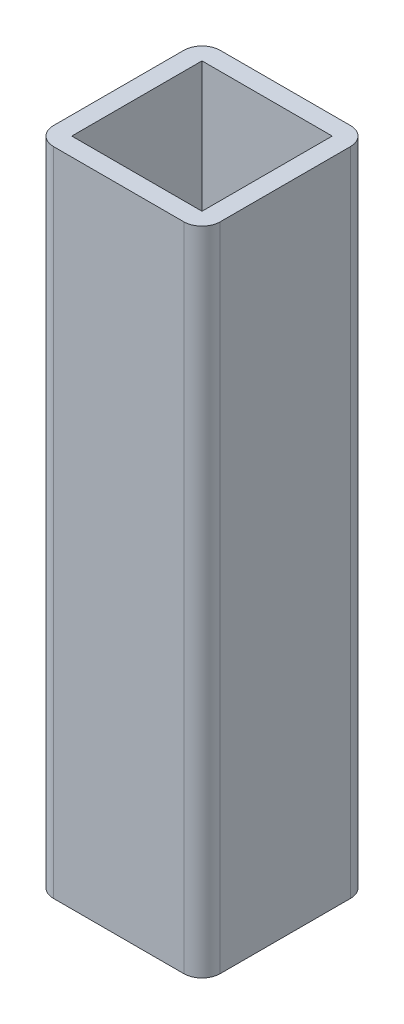
ISO-10303-21;
HEADER;
FILE_DESCRIPTION(('STEP AP214'),'2;1');
FILE_NAME('part.step','',(''),(''),'','','');
FILE_SCHEMA(('AUTOMOTIVE_DESIGN { 1 0 10303 214 1 1 1 1 }'));
ENDSEC;
DATA;
#1=APPLICATION_CONTEXT('core data for automotive mechanical design processes');
#2=APPLICATION_PROTOCOL_DEFINITION('international standard','automotive_design',2000,#1);
#3=PRODUCT_CONTEXT('',#1,'mechanical');
#4=PRODUCT('Part','Part','',(#3));
#5=PRODUCT_RELATED_PRODUCT_CATEGORY('part','',(#4));
#6=PRODUCT_DEFINITION_FORMATION('','',#4);
#7=PRODUCT_DEFINITION_CONTEXT('part definition',#1,'design');
#8=PRODUCT_DEFINITION('design','',#6,#7);
#9=PRODUCT_DEFINITION_SHAPE('','',#8);
#10=(LENGTH_UNIT() NAMED_UNIT(*) SI_UNIT(.MILLI.,.METRE.));
#11=(NAMED_UNIT(*) PLANE_ANGLE_UNIT() SI_UNIT($,.RADIAN.));
#12=(NAMED_UNIT(*) SI_UNIT($,.STERADIAN.) SOLID_ANGLE_UNIT());
#13=UNCERTAINTY_MEASURE_WITH_UNIT(LENGTH_MEASURE(1.E-05),#10,'distance_accuracy_value','');
#14=(GEOMETRIC_REPRESENTATION_CONTEXT(3) GLOBAL_UNCERTAINTY_ASSIGNED_CONTEXT((#13)) GLOBAL_UNIT_ASSIGNED_CONTEXT((#10,
#11,#12)) REPRESENTATION_CONTEXT('',''));
#15=CARTESIAN_POINT('',(0.,0.,0.));
#16=DIRECTION('',(0.,0.,1.));
#17=DIRECTION('',(1.,0.,0.));
#18=AXIS2_PLACEMENT_3D('',#15,#16,#17);
#19=CARTESIAN_POINT('',(22.8,100.,2.8));
#20=DIRECTION('',(0.,-1.,0.));
#21=DIRECTION('',(0.,0.,-1.));
#22=AXIS2_PLACEMENT_3D('',#19,#20,#21);
#23=CYLINDRICAL_SURFACE('',#22,2.8);
#24=CARTESIAN_POINT('',(22.8,0.,2.8));
#25=DIRECTION('',(0.,1.,0.));
#26=DIRECTION('',(0.,0.,-1.));
#27=AXIS2_PLACEMENT_3D('',#24,#25,#26);
#28=CIRCLE('',#27,2.8);
#29=CARTESIAN_POINT('',(25.6,0.,2.80000000000002));
#30=VERTEX_POINT('',#29);
#31=CARTESIAN_POINT('',(22.8,0.,0.));
#32=VERTEX_POINT('',#31);
#33=EDGE_CURVE('E157',#30,#32,#28,.T.);
#34=ORIENTED_EDGE('',*,*,#33,.T.);
#35=DIRECTION('',(0.,-1.,0.));
#36=VECTOR('',#35,1.);
#37=CARTESIAN_POINT('',(22.8,100.,0.));
#38=LINE('',#37,#36);
#39=CARTESIAN_POINT('',(22.8,100.,0.));
#40=VERTEX_POINT('',#39);
#41=EDGE_CURVE('E11',#40,#32,#38,.T.);
#42=ORIENTED_EDGE('',*,*,#41,.F.);
#43=CARTESIAN_POINT('',(22.8,100.,2.8));
#44=DIRECTION('',(0.,1.,0.));
#45=DIRECTION('',(0.,0.,-1.));
#46=AXIS2_PLACEMENT_3D('',#43,#44,#45);
#47=CIRCLE('',#46,2.8);
#48=CARTESIAN_POINT('',(25.6,100.,2.80000000000002));
#49=VERTEX_POINT('',#48);
#50=EDGE_CURVE('E158',#49,#40,#47,.T.);
#51=ORIENTED_EDGE('',*,*,#50,.F.);
#52=DIRECTION('',(0.,-1.,0.));
#53=VECTOR('',#52,1.);
#54=CARTESIAN_POINT('',(25.6,100.,2.80000000000002));
#55=LINE('',#54,#53);
#56=EDGE_CURVE('E176',#49,#30,#55,.T.);
#57=ORIENTED_EDGE('',*,*,#56,.T.);
#58=EDGE_LOOP('',(#34,#42,#51,#57));
#59=FACE_BOUND('',#58,.T.);
#60=ADVANCED_FACE('F32',(#59),#23,.T.);
#61=CARTESIAN_POINT('',(2.80000000000002,100.,0.));
#62=DIRECTION('',(0.,0.,1.));
#63=DIRECTION('',(1.,0.,0.));
#64=AXIS2_PLACEMENT_3D('',#61,#62,#63);
#65=PLANE('',#64);
#66=DIRECTION('',(-1.,0.,0.));
#67=VECTOR('',#66,1.);
#68=CARTESIAN_POINT('',(2.80000000000002,0.,0.));
#69=LINE('',#68,#67);
#70=CARTESIAN_POINT('',(2.80000000000002,0.,0.));
#71=VERTEX_POINT('',#70);
#72=EDGE_CURVE('E179',#32,#71,#69,.T.);
#73=ORIENTED_EDGE('',*,*,#72,.T.);
#74=DIRECTION('',(0.,-1.,0.));
#75=VECTOR('',#74,1.);
#76=CARTESIAN_POINT('',(2.80000000000002,100.,0.));
#77=LINE('',#76,#75);
#78=CARTESIAN_POINT('',(2.80000000000002,100.,0.));
#79=VERTEX_POINT('',#78);
#80=EDGE_CURVE('E39',#79,#71,#77,.T.);
#81=ORIENTED_EDGE('',*,*,#80,.F.);
#82=DIRECTION('',(-1.,0.,0.));
#83=VECTOR('',#82,1.);
#84=CARTESIAN_POINT('',(2.80000000000002,100.,0.));
#85=LINE('',#84,#83);
#86=EDGE_CURVE('E161',#40,#79,#85,.T.);
#87=ORIENTED_EDGE('',*,*,#86,.F.);
#88=ORIENTED_EDGE('',*,*,#41,.T.);
#89=EDGE_LOOP('',(#73,#81,#87,#88));
#90=FACE_BOUND('',#89,.T.);
#91=ADVANCED_FACE('F234',(#90),#65,.F.);
#92=CARTESIAN_POINT('',(2.8,100.,2.8));
#93=DIRECTION('',(0.,-1.,0.));
#94=DIRECTION('',(0.,0.,-1.));
#95=AXIS2_PLACEMENT_3D('',#92,#93,#94);
#96=CYLINDRICAL_SURFACE('',#95,2.8);
#97=CARTESIAN_POINT('',(2.8,0.,2.8));
#98=DIRECTION('',(0.,1.,0.));
#99=DIRECTION('',(0.,0.,1.));
#100=AXIS2_PLACEMENT_3D('',#97,#98,#99);
#101=CIRCLE('',#100,2.8);
#102=CARTESIAN_POINT('',(0.,0.,2.80000000000002));
#103=VERTEX_POINT('',#102);
#104=EDGE_CURVE('E181',#71,#103,#101,.T.);
#105=ORIENTED_EDGE('',*,*,#104,.T.);
#106=DIRECTION('',(0.,-1.,0.));
#107=VECTOR('',#106,1.);
#108=CARTESIAN_POINT('',(0.,100.,2.80000000000002));
#109=LINE('',#108,#107);
#110=CARTESIAN_POINT('',(0.,100.,2.80000000000002));
#111=VERTEX_POINT('',#110);
#112=EDGE_CURVE('E206',#111,#103,#109,.T.);
#113=ORIENTED_EDGE('',*,*,#112,.F.);
#114=CARTESIAN_POINT('',(2.8,100.,2.8));
#115=DIRECTION('',(0.,1.,0.));
#116=DIRECTION('',(0.,0.,1.));
#117=AXIS2_PLACEMENT_3D('',#114,#115,#116);
#118=CIRCLE('',#117,2.8);
#119=EDGE_CURVE('E164',#79,#111,#118,.T.);
#120=ORIENTED_EDGE('',*,*,#119,.F.);
#121=ORIENTED_EDGE('',*,*,#80,.T.);
#122=EDGE_LOOP('',(#105,#113,#120,#121));
#123=FACE_BOUND('',#122,.T.);
#124=ADVANCED_FACE('F213',(#123),#96,.T.);
#125=CARTESIAN_POINT('',(0.,100.,2.80000000000002));
#126=DIRECTION('',(1.,0.,0.));
#127=DIRECTION('',(0.,0.,-1.));
#128=AXIS2_PLACEMENT_3D('',#125,#126,#127);
#129=PLANE('',#128);
#130=DIRECTION('',(0.,0.,1.));
#131=VECTOR('',#130,1.);
#132=CARTESIAN_POINT('',(0.,0.,2.80000000000002));
#133=LINE('',#132,#131);
#134=CARTESIAN_POINT('',(0.,0.,22.8));
#135=VERTEX_POINT('',#134);
#136=EDGE_CURVE('E183',#103,#135,#133,.T.);
#137=ORIENTED_EDGE('',*,*,#136,.T.);
#138=DIRECTION('',(0.,-1.,0.));
#139=VECTOR('',#138,1.);
#140=CARTESIAN_POINT('',(0.,100.,22.8));
#141=LINE('',#140,#139);
#142=CARTESIAN_POINT('',(0.,100.,22.8));
#143=VERTEX_POINT('',#142);
#144=EDGE_CURVE('E203',#143,#135,#141,.T.);
#145=ORIENTED_EDGE('',*,*,#144,.F.);
#146=DIRECTION('',(0.,0.,1.));
#147=VECTOR('',#146,1.);
#148=CARTESIAN_POINT('',(0.,100.,2.80000000000002));
#149=LINE('',#148,#147);
#150=EDGE_CURVE('E166',#111,#143,#149,.T.);
#151=ORIENTED_EDGE('',*,*,#150,.F.);
#152=ORIENTED_EDGE('',*,*,#112,.T.);
#153=EDGE_LOOP('',(#137,#145,#151,#152));
#154=FACE_BOUND('',#153,.T.);
#155=ADVANCED_FACE('F222',(#154),#129,.F.);
#156=CARTESIAN_POINT('',(2.8,100.,22.8));
#157=DIRECTION('',(0.,-1.,0.));
#158=DIRECTION('',(0.,0.,-1.));
#159=AXIS2_PLACEMENT_3D('',#156,#157,#158);
#160=CYLINDRICAL_SURFACE('',#159,2.8);
#161=CARTESIAN_POINT('',(2.8,0.,22.8));
#162=DIRECTION('',(0.,1.,0.));
#163=DIRECTION('',(0.,0.,1.));
#164=AXIS2_PLACEMENT_3D('',#161,#162,#163);
#165=CIRCLE('',#164,2.8);
#166=CARTESIAN_POINT('',(2.80000000000002,0.,25.6));
#167=VERTEX_POINT('',#166);
#168=EDGE_CURVE('E185',#135,#167,#165,.T.);
#169=ORIENTED_EDGE('',*,*,#168,.T.);
#170=DIRECTION('',(0.,-1.,0.));
#171=VECTOR('',#170,1.);
#172=CARTESIAN_POINT('',(2.80000000000002,100.,25.6));
#173=LINE('',#172,#171);
#174=CARTESIAN_POINT('',(2.80000000000002,100.,25.6));
#175=VERTEX_POINT('',#174);
#176=EDGE_CURVE('E200',#175,#167,#173,.T.);
#177=ORIENTED_EDGE('',*,*,#176,.F.);
#178=CARTESIAN_POINT('',(2.8,100.,22.8));
#179=DIRECTION('',(0.,1.,0.));
#180=DIRECTION('',(0.,0.,1.));
#181=AXIS2_PLACEMENT_3D('',#178,#179,#180);
#182=CIRCLE('',#181,2.8);
#183=EDGE_CURVE('E168',#143,#175,#182,.T.);
#184=ORIENTED_EDGE('',*,*,#183,.F.);
#185=ORIENTED_EDGE('',*,*,#144,.T.);
#186=EDGE_LOOP('',(#169,#177,#184,#185));
#187=FACE_BOUND('',#186,.T.);
#188=ADVANCED_FACE('F226',(#187),#160,.T.);
#189=CARTESIAN_POINT('',(2.80000000000002,100.,25.6));
#190=DIRECTION('',(0.,0.,-1.));
#191=DIRECTION('',(-1.,0.,0.));
#192=AXIS2_PLACEMENT_3D('',#189,#190,#191);
#193=PLANE('',#192);
#194=DIRECTION('',(1.,0.,0.));
#195=VECTOR('',#194,1.);
#196=CARTESIAN_POINT('',(2.80000000000002,0.,25.6));
#197=LINE('',#196,#195);
#198=CARTESIAN_POINT('',(22.8,0.,25.6));
#199=VERTEX_POINT('',#198);
#200=EDGE_CURVE('E187',#167,#199,#197,.T.);
#201=ORIENTED_EDGE('',*,*,#200,.T.);
#202=DIRECTION('',(0.,-1.,0.));
#203=VECTOR('',#202,1.);
#204=CARTESIAN_POINT('',(22.8,100.,25.6));
#205=LINE('',#204,#203);
#206=CARTESIAN_POINT('',(22.8,100.,25.6));
#207=VERTEX_POINT('',#206);
#208=EDGE_CURVE('E197',#207,#199,#205,.T.);
#209=ORIENTED_EDGE('',*,*,#208,.F.);
#210=DIRECTION('',(1.,0.,0.));
#211=VECTOR('',#210,1.);
#212=CARTESIAN_POINT('',(2.80000000000002,100.,25.6));
#213=LINE('',#212,#211);
#214=EDGE_CURVE('E170',#175,#207,#213,.T.);
#215=ORIENTED_EDGE('',*,*,#214,.F.);
#216=ORIENTED_EDGE('',*,*,#176,.T.);
#217=EDGE_LOOP('',(#201,#209,#215,#216));
#218=FACE_BOUND('',#217,.T.);
#219=ADVANCED_FACE('F247',(#218),#193,.F.);
#220=CARTESIAN_POINT('',(22.8,100.,22.8));
#221=DIRECTION('',(0.,-1.,0.));
#222=DIRECTION('',(0.,0.,-1.));
#223=AXIS2_PLACEMENT_3D('',#220,#221,#222);
#224=CYLINDRICAL_SURFACE('',#223,2.8);
#225=CARTESIAN_POINT('',(22.8,0.,22.8));
#226=DIRECTION('',(0.,1.,0.));
#227=DIRECTION('',(0.,0.,1.));
#228=AXIS2_PLACEMENT_3D('',#225,#226,#227);
#229=CIRCLE('',#228,2.8);
#230=CARTESIAN_POINT('',(25.6,0.,22.8));
#231=VERTEX_POINT('',#230);
#232=EDGE_CURVE('E189',#199,#231,#229,.T.);
#233=ORIENTED_EDGE('',*,*,#232,.T.);
#234=DIRECTION('',(0.,-1.,0.));
#235=VECTOR('',#234,1.);
#236=CARTESIAN_POINT('',(25.6,100.,22.8));
#237=LINE('',#236,#235);
#238=CARTESIAN_POINT('',(25.6,100.,22.8));
#239=VERTEX_POINT('',#238);
#240=EDGE_CURVE('E194',#239,#231,#237,.T.);
#241=ORIENTED_EDGE('',*,*,#240,.F.);
#242=CARTESIAN_POINT('',(22.8,100.,22.8));
#243=DIRECTION('',(0.,1.,0.));
#244=DIRECTION('',(0.,0.,1.));
#245=AXIS2_PLACEMENT_3D('',#242,#243,#244);
#246=CIRCLE('',#245,2.8);
#247=EDGE_CURVE('E172',#207,#239,#246,.T.);
#248=ORIENTED_EDGE('',*,*,#247,.F.);
#249=ORIENTED_EDGE('',*,*,#208,.T.);
#250=EDGE_LOOP('',(#233,#241,#248,#249));
#251=FACE_BOUND('',#250,.T.);
#252=ADVANCED_FACE('F245',(#251),#224,.T.);
#253=CARTESIAN_POINT('',(25.6,100.,2.80000000000002));
#254=DIRECTION('',(-1.,0.,0.));
#255=DIRECTION('',(0.,0.,1.));
#256=AXIS2_PLACEMENT_3D('',#253,#254,#255);
#257=PLANE('',#256);
#258=DIRECTION('',(0.,0.,-1.));
#259=VECTOR('',#258,1.);
#260=CARTESIAN_POINT('',(25.6,0.,2.80000000000002));
#261=LINE('',#260,#259);
#262=EDGE_CURVE('E162',#231,#30,#261,.T.);
#263=ORIENTED_EDGE('',*,*,#262,.T.);
#264=ORIENTED_EDGE('',*,*,#56,.F.);
#265=DIRECTION('',(0.,0.,-1.));
#266=VECTOR('',#265,1.);
#267=CARTESIAN_POINT('',(25.6,100.,2.80000000000002));
#268=LINE('',#267,#266);
#269=EDGE_CURVE('E174',#239,#49,#268,.T.);
#270=ORIENTED_EDGE('',*,*,#269,.F.);
#271=ORIENTED_EDGE('',*,*,#240,.T.);
#272=EDGE_LOOP('',(#263,#264,#270,#271));
#273=FACE_BOUND('',#272,.T.);
#274=ADVANCED_FACE('F240',(#273),#257,.F.);
#275=CARTESIAN_POINT('',(22.8,100.,2.8));
#276=DIRECTION('',(0.,-1.,0.));
#277=DIRECTION('',(0.,0.,-1.));
#278=AXIS2_PLACEMENT_3D('',#275,#276,#277);
#279=PLANE('',#278);
#280=DIRECTION('',(1.,0.,0.));
#281=VECTOR('',#280,1.);
#282=CARTESIAN_POINT('',(22.8,100.,2.8));
#283=LINE('',#282,#281);
#284=CARTESIAN_POINT('',(2.8,100.,2.8));
#285=VERTEX_POINT('',#284);
#286=CARTESIAN_POINT('',(22.8,100.,2.8));
#287=VERTEX_POINT('',#286);
#288=EDGE_CURVE('E151',#285,#287,#283,.T.);
#289=ORIENTED_EDGE('',*,*,#288,.T.);
#290=DIRECTION('',(0.,0.,1.));
#291=VECTOR('',#290,1.);
#292=CARTESIAN_POINT('',(22.8,100.,2.8));
#293=LINE('',#292,#291);
#294=CARTESIAN_POINT('',(22.8,100.,22.8));
#295=VERTEX_POINT('',#294);
#296=EDGE_CURVE('E154',#287,#295,#293,.T.);
#297=ORIENTED_EDGE('',*,*,#296,.T.);
#298=DIRECTION('',(-1.,0.,0.));
#299=VECTOR('',#298,1.);
#300=CARTESIAN_POINT('',(22.8,100.,22.8));
#301=LINE('',#300,#299);
#302=CARTESIAN_POINT('',(2.8,100.,22.8));
#303=VERTEX_POINT('',#302);
#304=EDGE_CURVE('E146',#295,#303,#301,.T.);
#305=ORIENTED_EDGE('',*,*,#304,.T.);
#306=DIRECTION('',(0.,0.,-1.));
#307=VECTOR('',#306,1.);
#308=CARTESIAN_POINT('',(2.8,100.,2.79999999999999));
#309=LINE('',#308,#307);
#310=EDGE_CURVE('E126',#303,#285,#309,.T.);
#311=ORIENTED_EDGE('',*,*,#310,.T.);
#312=EDGE_LOOP('',(#289,#297,#305,#311));
#313=FACE_BOUND('',#312,.T.);
#314=ORIENTED_EDGE('',*,*,#50,.T.);
#315=ORIENTED_EDGE('',*,*,#86,.T.);
#316=ORIENTED_EDGE('',*,*,#119,.T.);
#317=ORIENTED_EDGE('',*,*,#150,.T.);
#318=ORIENTED_EDGE('',*,*,#183,.T.);
#319=ORIENTED_EDGE('',*,*,#214,.T.);
#320=ORIENTED_EDGE('',*,*,#247,.T.);
#321=ORIENTED_EDGE('',*,*,#269,.T.);
#322=EDGE_LOOP('',(#314,#315,#316,#317,#318,#319,#320,#321));
#323=FACE_BOUND('',#322,.T.);
#324=ADVANCED_FACE('F230',(#313,#323),#279,.F.);
#325=CARTESIAN_POINT('',(22.8,0.,2.8));
#326=DIRECTION('',(0.,-1.,0.));
#327=DIRECTION('',(0.,0.,-1.));
#328=AXIS2_PLACEMENT_3D('',#325,#326,#327);
#329=PLANE('',#328);
#330=DIRECTION('',(0.,0.,1.));
#331=VECTOR('',#330,1.);
#332=CARTESIAN_POINT('',(22.8,0.,2.8));
#333=LINE('',#332,#331);
#334=CARTESIAN_POINT('',(22.8,0.,2.8));
#335=VERTEX_POINT('',#334);
#336=CARTESIAN_POINT('',(22.8,0.,22.8));
#337=VERTEX_POINT('',#336);
#338=EDGE_CURVE('E54',#335,#337,#333,.T.);
#339=ORIENTED_EDGE('',*,*,#338,.F.);
#340=DIRECTION('',(1.,0.,0.));
#341=VECTOR('',#340,1.);
#342=CARTESIAN_POINT('',(2.8,0.,2.8));
#343=LINE('',#342,#341);
#344=CARTESIAN_POINT('',(2.8,0.,2.8));
#345=VERTEX_POINT('',#344);
#346=EDGE_CURVE('E139',#345,#335,#343,.T.);
#347=ORIENTED_EDGE('',*,*,#346,.F.);
#348=DIRECTION('',(0.,0.,-1.));
#349=VECTOR('',#348,1.);
#350=CARTESIAN_POINT('',(2.8,0.,2.8));
#351=LINE('',#350,#349);
#352=CARTESIAN_POINT('',(2.8,0.,22.8));
#353=VERTEX_POINT('',#352);
#354=EDGE_CURVE('E123',#353,#345,#351,.T.);
#355=ORIENTED_EDGE('',*,*,#354,.F.);
#356=DIRECTION('',(-1.,0.,0.));
#357=VECTOR('',#356,1.);
#358=CARTESIAN_POINT('',(2.8,0.,22.8));
#359=LINE('',#358,#357);
#360=EDGE_CURVE('E132',#337,#353,#359,.T.);
#361=ORIENTED_EDGE('',*,*,#360,.F.);
#362=EDGE_LOOP('',(#339,#347,#355,#361));
#363=FACE_BOUND('',#362,.T.);
#364=ORIENTED_EDGE('',*,*,#33,.F.);
#365=ORIENTED_EDGE('',*,*,#262,.F.);
#366=ORIENTED_EDGE('',*,*,#232,.F.);
#367=ORIENTED_EDGE('',*,*,#200,.F.);
#368=ORIENTED_EDGE('',*,*,#168,.F.);
#369=ORIENTED_EDGE('',*,*,#136,.F.);
#370=ORIENTED_EDGE('',*,*,#104,.F.);
#371=ORIENTED_EDGE('',*,*,#72,.F.);
#372=EDGE_LOOP('',(#364,#365,#366,#367,#368,#369,#370,#371));
#373=FACE_BOUND('',#372,.T.);
#374=ADVANCED_FACE('F136',(#363,#373),#329,.T.);
#375=CARTESIAN_POINT('',(22.8,1040.5,2.8));
#376=DIRECTION('',(1.,0.,0.));
#377=DIRECTION('',(0.,0.,-1.));
#378=AXIS2_PLACEMENT_3D('',#375,#376,#377);
#379=PLANE('',#378);
#380=DIRECTION('',(0.,-1.,0.));
#381=VECTOR('',#380,1.);
#382=CARTESIAN_POINT('',(22.8,1040.5,2.8));
#383=LINE('',#382,#381);
#384=EDGE_CURVE('E144',#287,#335,#383,.T.);
#385=ORIENTED_EDGE('',*,*,#384,.T.);
#386=ORIENTED_EDGE('',*,*,#338,.T.);
#387=DIRECTION('',(0.,-1.,0.));
#388=VECTOR('',#387,1.);
#389=CARTESIAN_POINT('',(22.8,1040.5,22.8));
#390=LINE('',#389,#388);
#391=EDGE_CURVE('E129',#295,#337,#390,.T.);
#392=ORIENTED_EDGE('',*,*,#391,.F.);
#393=ORIENTED_EDGE('',*,*,#296,.F.);
#394=EDGE_LOOP('',(#385,#386,#392,#393));
#395=FACE_BOUND('',#394,.T.);
#396=ADVANCED_FACE('F310',(#395),#379,.F.);
#397=CARTESIAN_POINT('',(2.8,1040.5,2.8));
#398=DIRECTION('',(0.,0.,-1.));
#399=DIRECTION('',(-1.,0.,0.));
#400=AXIS2_PLACEMENT_3D('',#397,#398,#399);
#401=PLANE('',#400);
#402=DIRECTION('',(0.,-1.,0.));
#403=VECTOR('',#402,1.);
#404=CARTESIAN_POINT('',(2.8,1040.5,2.8));
#405=LINE('',#404,#403);
#406=EDGE_CURVE('E128',#285,#345,#405,.T.);
#407=ORIENTED_EDGE('',*,*,#406,.T.);
#408=ORIENTED_EDGE('',*,*,#346,.T.);
#409=ORIENTED_EDGE('',*,*,#384,.F.);
#410=ORIENTED_EDGE('',*,*,#288,.F.);
#411=EDGE_LOOP('',(#407,#408,#409,#410));
#412=FACE_BOUND('',#411,.T.);
#413=ADVANCED_FACE('F319',(#412),#401,.F.);
#414=CARTESIAN_POINT('',(2.8,1040.5,2.8));
#415=DIRECTION('',(-1.,0.,0.));
#416=DIRECTION('',(0.,0.,1.));
#417=AXIS2_PLACEMENT_3D('',#414,#415,#416);
#418=PLANE('',#417);
#419=DIRECTION('',(0.,-1.,0.));
#420=VECTOR('',#419,1.);
#421=CARTESIAN_POINT('',(2.8,1040.5,22.8));
#422=LINE('',#421,#420);
#423=EDGE_CURVE('E46',#303,#353,#422,.T.);
#424=ORIENTED_EDGE('',*,*,#423,.T.);
#425=ORIENTED_EDGE('',*,*,#354,.T.);
#426=ORIENTED_EDGE('',*,*,#406,.F.);
#427=ORIENTED_EDGE('',*,*,#310,.F.);
#428=EDGE_LOOP('',(#424,#425,#426,#427));
#429=FACE_BOUND('',#428,.T.);
#430=ADVANCED_FACE('F120',(#429),#418,.F.);
#431=CARTESIAN_POINT('',(2.8,1040.5,22.8));
#432=DIRECTION('',(0.,0.,1.));
#433=DIRECTION('',(1.,0.,0.));
#434=AXIS2_PLACEMENT_3D('',#431,#432,#433);
#435=PLANE('',#434);
#436=ORIENTED_EDGE('',*,*,#391,.T.);
#437=ORIENTED_EDGE('',*,*,#360,.T.);
#438=ORIENTED_EDGE('',*,*,#423,.F.);
#439=ORIENTED_EDGE('',*,*,#304,.F.);
#440=EDGE_LOOP('',(#436,#437,#438,#439));
#441=FACE_BOUND('',#440,.T.);
#442=ADVANCED_FACE('F133',(#441),#435,.F.);
#443=CLOSED_SHELL('',(#60,#91,#124,#155,#188,#219,#252,#274,#324,#374,#396,#413,#430,#442));
#444=MANIFOLD_SOLID_BREP('B2',#443);
#445=ADVANCED_BREP_SHAPE_REPRESENTATION('',(#18,#444),#14);
#446=SHAPE_DEFINITION_REPRESENTATION(#9,#445);
ENDSEC;
END-ISO-10303-21;
